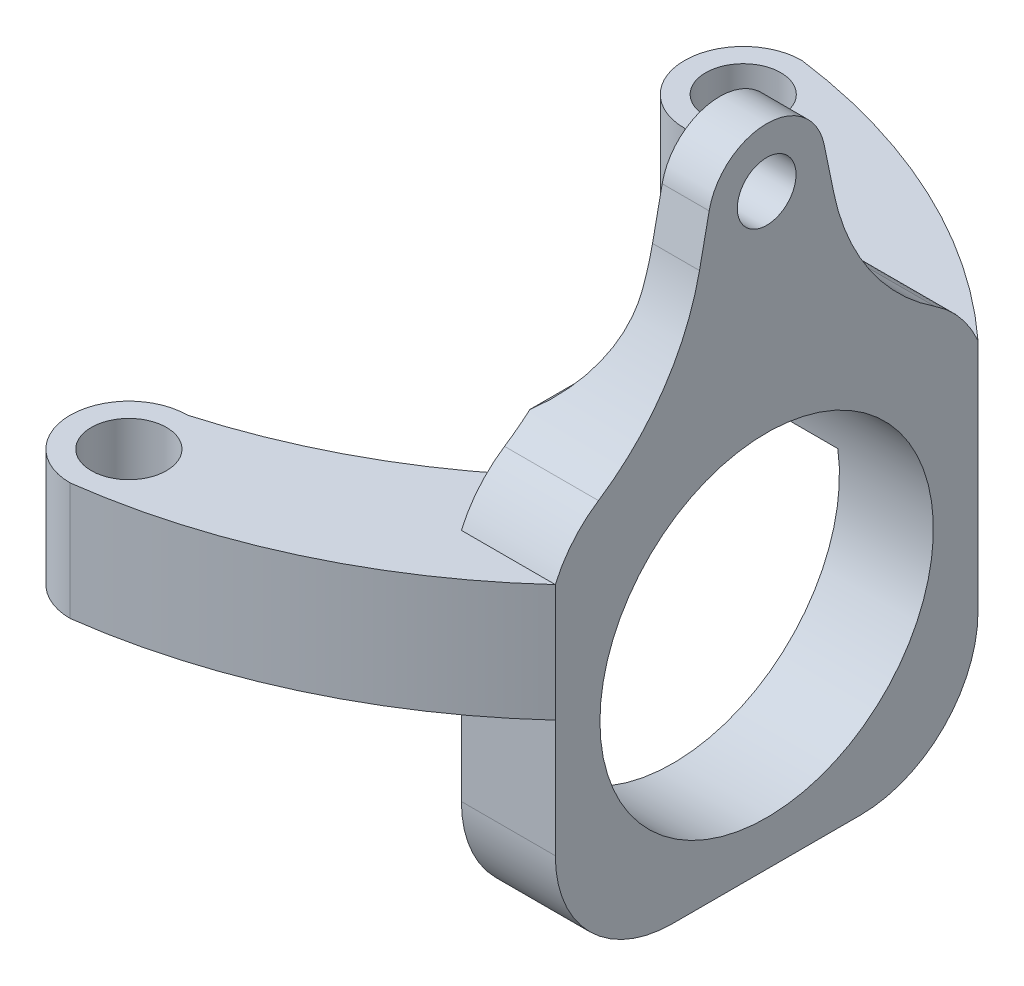
ISO-10303-21;
HEADER;
FILE_DESCRIPTION(('STEP AP214'),'2;1');
FILE_NAME('part.step','',(''),(''),'','','');
FILE_SCHEMA(('AUTOMOTIVE_DESIGN { 1 0 10303 214 1 1 1 1 }'));
ENDSEC;
DATA;
#1=APPLICATION_CONTEXT('core data for automotive mechanical design processes');
#2=APPLICATION_PROTOCOL_DEFINITION('international standard','automotive_design',2000,#1);
#3=PRODUCT_CONTEXT('',#1,'mechanical');
#4=PRODUCT('Part','Part','',(#3));
#5=PRODUCT_RELATED_PRODUCT_CATEGORY('part','',(#4));
#6=PRODUCT_DEFINITION_FORMATION('','',#4);
#7=PRODUCT_DEFINITION_CONTEXT('part definition',#1,'design');
#8=PRODUCT_DEFINITION('design','',#6,#7);
#9=PRODUCT_DEFINITION_SHAPE('','',#8);
#10=(LENGTH_UNIT() NAMED_UNIT(*) SI_UNIT(.MILLI.,.METRE.));
#11=(NAMED_UNIT(*) PLANE_ANGLE_UNIT() SI_UNIT($,.RADIAN.));
#12=(NAMED_UNIT(*) SI_UNIT($,.STERADIAN.) SOLID_ANGLE_UNIT());
#13=UNCERTAINTY_MEASURE_WITH_UNIT(LENGTH_MEASURE(1.E-05),#10,'distance_accuracy_value','');
#14=(GEOMETRIC_REPRESENTATION_CONTEXT(3) GLOBAL_UNCERTAINTY_ASSIGNED_CONTEXT((#13)) GLOBAL_UNIT_ASSIGNED_CONTEXT((#10,
#11,#12)) REPRESENTATION_CONTEXT('',''));
#15=CARTESIAN_POINT('',(0.,0.,0.));
#16=DIRECTION('',(0.,0.,1.));
#17=DIRECTION('',(1.,0.,0.));
#18=AXIS2_PLACEMENT_3D('',#15,#16,#17);
#19=CARTESIAN_POINT('',(0.,0.,0.));
#20=DIRECTION('',(0.,1.,0.));
#21=DIRECTION('',(0.,0.,1.));
#22=AXIS2_PLACEMENT_3D('',#19,#20,#21);
#23=PLANE('',#22);
#24=CARTESIAN_POINT('',(13.0814754519511,0.,13.0814754519511));
#25=DIRECTION('',(0.,1.,0.));
#26=DIRECTION('',(0.,0.,1.));
#27=AXIS2_PLACEMENT_3D('',#24,#25,#26);
#28=CIRCLE('',#27,1.6);
#29=CARTESIAN_POINT('',(13.0814754519511,0.,14.6814754519511));
#30=VERTEX_POINT('',#29);
#31=EDGE_CURVE('E392',#30,#30,#28,.T.);
#32=ORIENTED_EDGE('',*,*,#31,.T.);
#33=EDGE_LOOP('',(#32));
#34=FACE_BOUND('',#33,.T.);
#35=DIRECTION('',(-1.,0.,0.));
#36=VECTOR('',#35,1.);
#37=CARTESIAN_POINT('',(27.160012,0.,7.02922470831599));
#38=LINE('',#37,#36);
#39=CARTESIAN_POINT('',(23.16,0.,7.02922470831599));
#40=VERTEX_POINT('',#39);
#41=CARTESIAN_POINT('',(20.5928172828734,0.,7.02922470831598));
#42=VERTEX_POINT('',#41);
#43=EDGE_CURVE('E272',#40,#42,#38,.T.);
#44=ORIENTED_EDGE('',*,*,#43,.F.);
#45=DIRECTION('',(0.,0.,1.));
#46=VECTOR('',#45,1.);
#47=CARTESIAN_POINT('',(23.16,0.,0.));
#48=LINE('',#47,#46);
#49=CARTESIAN_POINT('',(23.16,0.,9.00000000000001));
#50=VERTEX_POINT('',#49);
#51=EDGE_CURVE('E431',#40,#50,#48,.T.);
#52=ORIENTED_EDGE('',*,*,#51,.T.);
#53=DIRECTION('',(1.,0.,0.));
#54=VECTOR('',#53,1.);
#55=CARTESIAN_POINT('',(0.,0.,9.00000000000001));
#56=LINE('',#55,#54);
#57=CARTESIAN_POINT('',(27.16,0.,9.00000000000001));
#58=VERTEX_POINT('',#57);
#59=EDGE_CURVE('E366',#50,#58,#56,.T.);
#60=ORIENTED_EDGE('',*,*,#59,.T.);
#61=CARTESIAN_POINT('',(9.70020057178157,0.,-10.));
#62=DIRECTION('',(0.,1.,0.));
#63=DIRECTION('',(0.,0.,1.));
#64=AXIS2_PLACEMENT_3D('',#61,#62,#63);
#65=CIRCLE('',#64,25.8039647355521);
#66=CARTESIAN_POINT('',(13.0814754519511,0.,15.5814693920883));
#67=VERTEX_POINT('',#66);
#68=EDGE_CURVE('E388',#67,#58,#65,.T.);
#69=ORIENTED_EDGE('',*,*,#68,.F.);
#70=CARTESIAN_POINT('',(13.0814754519511,0.,13.0814754519511));
#71=DIRECTION('',(0.,1.,0.));
#72=DIRECTION('',(0.,0.,1.));
#73=AXIS2_PLACEMENT_3D('',#70,#71,#72);
#74=CIRCLE('',#73,2.49999394013718);
#75=CARTESIAN_POINT('',(13.0814754519511,0.,10.5814815118139));
#76=VERTEX_POINT('',#75);
#77=EDGE_CURVE('E380',#76,#67,#74,.T.);
#78=ORIENTED_EDGE('',*,*,#77,.F.);
#79=CARTESIAN_POINT('',(6.04634623357923,0.,-14.0120818103403));
#80=DIRECTION('',(0.,1.,0.));
#81=DIRECTION('',(0.,0.,1.));
#82=AXIS2_PLACEMENT_3D('',#79,#80,#81);
#83=CIRCLE('',#82,25.58);
#84=EDGE_CURVE('E374',#76,#42,#83,.T.);
#85=ORIENTED_EDGE('',*,*,#84,.T.);
#86=EDGE_LOOP('',(#44,#52,#60,#69,#78,#85));
#87=FACE_BOUND('',#86,.T.);
#88=ADVANCED_FACE('F47',(#34,#87),#23,.F.);
#89=CARTESIAN_POINT('',(6.04634623357923,5.,14.0120818103403));
#90=DIRECTION('',(0.,-1.,0.));
#91=DIRECTION('',(0.,0.,-1.));
#92=AXIS2_PLACEMENT_3D('',#89,#90,#91);
#93=CYLINDRICAL_SURFACE('',#92,25.58);
#94=CARTESIAN_POINT('',(23.16,4.04083326445143,-5.));
#95=CARTESIAN_POINT('',(23.0852943202328,3.97412735172246,-5.06724700390507));
#96=CARTESIAN_POINT('',(23.0109565428041,3.90588068818783,-5.13336354920835));
#97=CARTESIAN_POINT('',(22.863200328918,3.76623627002666,-5.2632779060603));
#98=CARTESIAN_POINT('',(22.7897819922412,3.69483817713681,-5.32707546735068));
#99=CARTESIAN_POINT('',(22.570841527965,3.47546964969385,-5.51519434159949));
#100=CARTESIAN_POINT('',(22.4270091501767,3.32265760815931,-5.63590515854725));
#101=CARTESIAN_POINT('',(22.1427514474512,2.99996249508106,-5.8694855010599));
#102=CARTESIAN_POINT('',(22.0024771011734,2.82977114061024,-5.98211546763139));
#103=CARTESIAN_POINT('',(21.7319251102006,2.47477232280944,-6.19506174037352));
#104=CARTESIAN_POINT('',(21.6016359235024,2.28998225213862,-6.2953923465647));
#105=CARTESIAN_POINT('',(21.322546358829,1.85450736729992,-6.50649415832463));
#106=CARTESIAN_POINT('',(21.177709605604,1.59916275058544,-6.61322386028865));
#107=CARTESIAN_POINT('',(20.9853938491709,1.19854894091981,-6.75249268057375));
#108=CARTESIAN_POINT('',(20.9256329567606,1.06264991574295,-6.79531584655178));
#109=CARTESIAN_POINT('',(20.815724353177,0.784974750039779,-6.87347285181422));
#110=CARTESIAN_POINT('',(20.7655690389633,0.64320336664378,-6.90881261674726));
#111=CARTESIAN_POINT('',(20.6959264969238,0.417353286927893,-6.95759021633829));
#112=CARTESIAN_POINT('',(20.672598335456,0.335050697740693,-6.97386205457585));
#113=CARTESIAN_POINT('',(20.6297505464991,0.168723740126676,-7.00365967338303));
#114=CARTESIAN_POINT('',(20.6102415790482,0.0846952559486462,-7.01717777192724));
#115=CARTESIAN_POINT('',(20.5928172828734,0.,-7.02922470831599));
#116=B_SPLINE_CURVE_WITH_KNOTS('',3,(#94,#95,#96,#97,#98,#99,#100,#101,#102,#103,#104,#105,#106,
#107,#108,#109,#110,#111,#112,#113,#114,#115),.UNSPECIFIED.,.F.,.F.,(4,2,2,2,2,2,2,2,2,2,4),(0.,
0.36187449644276,0.723787930124017,1.44942294603131,2.19149503318238,2.9326959881572,
3.86614154665823,4.32921569978565,4.79192179012689,5.05302885628701,5.31485464009586),.UNSPECIFIED.);
#117=CARTESIAN_POINT('',(23.16,4.04083326445143,-5.));
#118=VERTEX_POINT('',#117);
#119=CARTESIAN_POINT('',(20.5928172828734,0.,-7.02922470831598));
#120=VERTEX_POINT('',#119);
#121=EDGE_CURVE('E262',#118,#120,#116,.T.);
#122=ORIENTED_EDGE('',*,*,#121,.F.);
#123=DIRECTION('',(0.,-1.,0.));
#124=VECTOR('',#123,1.);
#125=CARTESIAN_POINT('',(23.16,5.,-5.));
#126=LINE('',#125,#124);
#127=CARTESIAN_POINT('',(23.16,5.,-5.));
#128=VERTEX_POINT('',#127);
#129=EDGE_CURVE('E414',#128,#118,#126,.T.);
#130=ORIENTED_EDGE('',*,*,#129,.F.);
#131=CARTESIAN_POINT('',(6.04634623357923,5.,14.0120818103403));
#132=DIRECTION('',(0.,1.,0.));
#133=DIRECTION('',(0.,0.,1.));
#134=AXIS2_PLACEMENT_3D('',#131,#132,#133);
#135=CIRCLE('',#134,25.58);
#136=CARTESIAN_POINT('',(13.0814754519511,5.,-10.5814815118139));
#137=VERTEX_POINT('',#136);
#138=EDGE_CURVE('E542',#137,#128,#135,.F.);
#139=ORIENTED_EDGE('',*,*,#138,.F.);
#140=DIRECTION('',(0.,-1.,0.));
#141=VECTOR('',#140,1.);
#142=CARTESIAN_POINT('',(13.0814754519511,5.,-10.5814815118139));
#143=LINE('',#142,#141);
#144=CARTESIAN_POINT('',(13.0814754519511,0.,-10.5814815118139));
#145=VERTEX_POINT('',#144);
#146=EDGE_CURVE('E372',#137,#145,#143,.T.);
#147=ORIENTED_EDGE('',*,*,#146,.T.);
#148=CARTESIAN_POINT('',(6.04634623357923,0.,14.0120818103403));
#149=DIRECTION('',(0.,1.,0.));
#150=DIRECTION('',(0.,0.,1.));
#151=AXIS2_PLACEMENT_3D('',#148,#149,#150);
#152=CIRCLE('',#151,25.58);
#153=EDGE_CURVE('E359',#145,#120,#152,.F.);
#154=ORIENTED_EDGE('',*,*,#153,.T.);
#155=EDGE_LOOP('',(#122,#130,#139,#147,#154));
#156=FACE_BOUND('',#155,.T.);
#157=ADVANCED_FACE('F274',(#156),#93,.F.);
#158=CARTESIAN_POINT('',(23.16,5.,0.));
#159=DIRECTION('',(-1.,0.,0.));
#160=DIRECTION('',(0.,0.,1.));
#161=AXIS2_PLACEMENT_3D('',#158,#159,#160);
#162=PLANE('',#161);
#163=DIRECTION('',(0.,0.,1.));
#164=VECTOR('',#163,1.);
#165=CARTESIAN_POINT('',(23.16,8.,-8.99999999999999));
#166=LINE('',#165,#164);
#167=CARTESIAN_POINT('',(23.16,8.,-6.08085473935847));
#168=VERTEX_POINT('',#167);
#169=CARTESIAN_POINT('',(23.16,8.,6.08085473935848));
#170=VERTEX_POINT('',#169);
#171=EDGE_CURVE('E64',#168,#170,#166,.T.);
#172=ORIENTED_EDGE('',*,*,#171,.F.);
#173=CARTESIAN_POINT('',(23.16,15.5367170879168,-12.6533653355236));
#174=DIRECTION('',(-1.,0.,0.));
#175=DIRECTION('',(0.,0.,1.));
#176=AXIS2_PLACEMENT_3D('',#173,#174,#175);
#177=CIRCLE('',#176,10.);
#178=CARTESIAN_POINT('',(23.16,7.17890569597227,-7.16273798187063));
#179=VERTEX_POINT('',#178);
#180=EDGE_CURVE('E503',#168,#179,#177,.F.);
#181=ORIENTED_EDGE('',*,*,#180,.T.);
#182=CARTESIAN_POINT('',(23.16,3.,-4.41742430504415));
#183=DIRECTION('',(-1.,0.,0.));
#184=DIRECTION('',(0.,0.,1.));
#185=AXIS2_PLACEMENT_3D('',#182,#183,#184);
#186=CIRCLE('',#185,5.);
#187=CARTESIAN_POINT('',(23.16,5.,-8.99999999999999));
#188=VERTEX_POINT('',#187);
#189=EDGE_CURVE('E471',#179,#188,#186,.T.);
#190=ORIENTED_EDGE('',*,*,#189,.T.);
#191=DIRECTION('',(0.,0.,1.));
#192=VECTOR('',#191,1.);
#193=CARTESIAN_POINT('',(23.16,5.,0.));
#194=LINE('',#193,#192);
#195=EDGE_CURVE('E537',#188,#128,#194,.T.);
#196=ORIENTED_EDGE('',*,*,#195,.T.);
#197=ORIENTED_EDGE('',*,*,#129,.T.);
#198=CARTESIAN_POINT('',(23.16,-1.,0.));
#199=DIRECTION('',(-1.,0.,0.));
#200=DIRECTION('',(0.,0.,1.));
#201=AXIS2_PLACEMENT_3D('',#198,#199,#200);
#202=CIRCLE('',#201,7.1);
#203=CARTESIAN_POINT('',(23.16,4.04083326445141,5.00000000000001));
#204=VERTEX_POINT('',#203);
#205=EDGE_CURVE('E263',#118,#204,#202,.F.);
#206=ORIENTED_EDGE('',*,*,#205,.T.);
#207=DIRECTION('',(0.,-1.,0.));
#208=VECTOR('',#207,1.);
#209=CARTESIAN_POINT('',(23.16,5.,5.00000000000001));
#210=LINE('',#209,#208);
#211=CARTESIAN_POINT('',(23.16,5.,5.00000000000001));
#212=VERTEX_POINT('',#211);
#213=EDGE_CURVE('E410',#212,#204,#210,.T.);
#214=ORIENTED_EDGE('',*,*,#213,.F.);
#215=CARTESIAN_POINT('',(23.16,5.,9.00000000000001));
#216=VERTEX_POINT('',#215);
#217=EDGE_CURVE('E545',#212,#216,#194,.T.);
#218=ORIENTED_EDGE('',*,*,#217,.T.);
#219=CARTESIAN_POINT('',(23.16,3.,4.41742430504417));
#220=DIRECTION('',(-1.,0.,0.));
#221=DIRECTION('',(0.,0.,1.));
#222=AXIS2_PLACEMENT_3D('',#219,#220,#221);
#223=CIRCLE('',#222,5.);
#224=CARTESIAN_POINT('',(23.16,7.17890569597227,7.16273798187064));
#225=VERTEX_POINT('',#224);
#226=EDGE_CURVE('E467',#216,#225,#223,.T.);
#227=ORIENTED_EDGE('',*,*,#226,.T.);
#228=CARTESIAN_POINT('',(23.16,15.5367170879168,12.6533653355236));
#229=DIRECTION('',(-1.,0.,0.));
#230=DIRECTION('',(0.,0.,1.));
#231=AXIS2_PLACEMENT_3D('',#228,#229,#230);
#232=CIRCLE('',#231,10.);
#233=EDGE_CURVE('E645',#225,#170,#232,.F.);
#234=ORIENTED_EDGE('',*,*,#233,.T.);
#235=EDGE_LOOP('',(#172,#181,#190,#196,#197,#206,#214,#218,#227,#234));
#236=FACE_BOUND('',#235,.T.);
#237=ADVANCED_FACE('F307',(#236),#162,.T.);
#238=CARTESIAN_POINT('',(6.04634623357923,5.,-14.0120818103403));
#239=DIRECTION('',(0.,-1.,0.));
#240=DIRECTION('',(0.,0.,-1.));
#241=AXIS2_PLACEMENT_3D('',#238,#239,#240);
#242=CYLINDRICAL_SURFACE('',#241,25.58);
#243=ORIENTED_EDGE('',*,*,#213,.T.);
#244=CARTESIAN_POINT('',(23.16,4.04083326445141,5.00000000000001));
#245=CARTESIAN_POINT('',(23.0852943202328,3.97412735172244,5.06724700390508));
#246=CARTESIAN_POINT('',(23.0109565428041,3.90588068818782,5.13336354920836));
#247=CARTESIAN_POINT('',(22.863200328918,3.76623627002664,5.26327790606031));
#248=CARTESIAN_POINT('',(22.7897819922412,3.6948381771368,5.32707546735069));
#249=CARTESIAN_POINT('',(22.570841527965,3.47546964969384,5.5151943415995));
#250=CARTESIAN_POINT('',(22.4270091501767,3.3226576081593,5.63590515854726));
#251=CARTESIAN_POINT('',(22.1427514474512,2.99996249508104,5.86948550105991));
#252=CARTESIAN_POINT('',(22.0024771011734,2.82977114061023,5.98211546763139));
#253=CARTESIAN_POINT('',(21.7319251102006,2.47477232280943,6.19506174037353));
#254=CARTESIAN_POINT('',(21.6016359235024,2.28998225213862,6.2953923465647));
#255=CARTESIAN_POINT('',(21.322546358829,1.85450736729991,6.50649415832464));
#256=CARTESIAN_POINT('',(21.177709605604,1.59916275058543,6.61322386028865));
#257=CARTESIAN_POINT('',(20.9853938491709,1.19854894091981,6.75249268057375));
#258=CARTESIAN_POINT('',(20.9256329567606,1.06264991574294,6.79531584655179));
#259=CARTESIAN_POINT('',(20.8157243531771,0.784974750039771,6.87347285181422));
#260=CARTESIAN_POINT('',(20.7655690389633,0.643203366643772,6.90881261674726));
#261=CARTESIAN_POINT('',(20.6959264969238,0.417353286927885,6.95759021633829));
#262=CARTESIAN_POINT('',(20.672598335456,0.335050697740686,6.97386205457585));
#263=CARTESIAN_POINT('',(20.6297505464991,0.16872374012667,7.00365967338304));
#264=CARTESIAN_POINT('',(20.6102415790482,0.0846952559486421,7.01717777192724));
#265=CARTESIAN_POINT('',(20.5928172828734,0.,7.02922470831599));
#266=B_SPLINE_CURVE_WITH_KNOTS('',3,(#244,#245,#246,#247,#248,#249,#250,#251,#252,#253,#254,
#255,#256,#257,#258,#259,#260,#261,#262,#263,#264,#265),.UNSPECIFIED.,.F.,.F.,(4,2,2,2,2,2,2,2,
2,2,4),(0.,0.361874496442758,0.723787930124015,1.44942294603131,2.19149503318237,
2.93269598815719,3.86614154665822,4.32921569978564,4.79192179012688,5.05302885628699,
5.31485464009584),.UNSPECIFIED.);
#267=EDGE_CURVE('E291',#204,#42,#266,.T.);
#268=ORIENTED_EDGE('',*,*,#267,.T.);
#269=ORIENTED_EDGE('',*,*,#84,.F.);
#270=DIRECTION('',(0.,-1.,0.));
#271=VECTOR('',#270,1.);
#272=CARTESIAN_POINT('',(13.0814754519511,5.,10.5814815118139));
#273=LINE('',#272,#271);
#274=CARTESIAN_POINT('',(13.0814754519511,5.,10.5814815118139));
#275=VERTEX_POINT('',#274);
#276=EDGE_CURVE('E407',#275,#76,#273,.T.);
#277=ORIENTED_EDGE('',*,*,#276,.F.);
#278=CARTESIAN_POINT('',(6.04634623357923,5.,-14.0120818103403));
#279=DIRECTION('',(0.,1.,0.));
#280=DIRECTION('',(0.,0.,1.));
#281=AXIS2_PLACEMENT_3D('',#278,#279,#280);
#282=CIRCLE('',#281,25.58);
#283=EDGE_CURVE('E564',#275,#212,#282,.T.);
#284=ORIENTED_EDGE('',*,*,#283,.T.);
#285=EDGE_LOOP('',(#243,#268,#269,#277,#284));
#286=FACE_BOUND('',#285,.T.);
#287=ADVANCED_FACE('F302',(#286),#242,.F.);
#288=CARTESIAN_POINT('',(13.0814754519511,0.,-13.0814754519511));
#289=DIRECTION('',(0.,1.,0.));
#290=DIRECTION('',(0.,0.,1.));
#291=AXIS2_PLACEMENT_3D('',#288,#289,#290);
#292=CIRCLE('',#291,1.6);
#293=CARTESIAN_POINT('',(13.0814754519511,0.,-11.4814754519511));
#294=VERTEX_POINT('',#293);
#295=EDGE_CURVE('E352',#294,#294,#292,.T.);
#296=ORIENTED_EDGE('',*,*,#295,.T.);
#297=EDGE_LOOP('',(#296));
#298=FACE_BOUND('',#297,.T.);
#299=DIRECTION('',(-1.,0.,0.));
#300=VECTOR('',#299,1.);
#301=CARTESIAN_POINT('',(27.160012,0.,-7.02922470831599));
#302=LINE('',#301,#300);
#303=CARTESIAN_POINT('',(23.16,0.,-7.02922470831599));
#304=VERTEX_POINT('',#303);
#305=EDGE_CURVE('E356',#120,#304,#302,.F.);
#306=ORIENTED_EDGE('',*,*,#305,.F.);
#307=ORIENTED_EDGE('',*,*,#153,.F.);
#308=CARTESIAN_POINT('',(13.0814754519511,0.,-13.0814754519511));
#309=DIRECTION('',(0.,1.,0.));
#310=DIRECTION('',(0.,0.,1.));
#311=AXIS2_PLACEMENT_3D('',#308,#309,#310);
#312=CIRCLE('',#311,2.49999394013718);
#313=CARTESIAN_POINT('',(13.0814754519511,0.,-15.5814693920883));
#314=VERTEX_POINT('',#313);
#315=EDGE_CURVE('E375',#145,#314,#312,.F.);
#316=ORIENTED_EDGE('',*,*,#315,.T.);
#317=CARTESIAN_POINT('',(9.70020057178158,0.,10.));
#318=DIRECTION('',(0.,1.,0.));
#319=DIRECTION('',(0.,0.,1.));
#320=AXIS2_PLACEMENT_3D('',#317,#318,#319);
#321=CIRCLE('',#320,25.8039647355521);
#322=CARTESIAN_POINT('',(27.16,0.,-8.99999999999999));
#323=VERTEX_POINT('',#322);
#324=EDGE_CURVE('E382',#314,#323,#321,.F.);
#325=ORIENTED_EDGE('',*,*,#324,.T.);
#326=DIRECTION('',(-1.,0.,0.));
#327=VECTOR('',#326,1.);
#328=CARTESIAN_POINT('',(0.,0.,-8.99999999999998));
#329=LINE('',#328,#327);
#330=CARTESIAN_POINT('',(23.16,0.,-8.99999999999999));
#331=VERTEX_POINT('',#330);
#332=EDGE_CURVE('E426',#323,#331,#329,.T.);
#333=ORIENTED_EDGE('',*,*,#332,.T.);
#334=EDGE_CURVE('E363',#331,#304,#48,.T.);
#335=ORIENTED_EDGE('',*,*,#334,.T.);
#336=EDGE_LOOP('',(#306,#307,#316,#325,#333,#335));
#337=FACE_BOUND('',#336,.T.);
#338=ADVANCED_FACE('F306',(#298,#337),#23,.F.);
#339=CARTESIAN_POINT('',(0.,5.,0.));
#340=DIRECTION('',(0.,1.,0.));
#341=DIRECTION('',(0.,0.,1.));
#342=AXIS2_PLACEMENT_3D('',#339,#340,#341);
#343=PLANE('',#342);
#344=DIRECTION('',(1.,0.,0.));
#345=VECTOR('',#344,1.);
#346=CARTESIAN_POINT('',(0.,5.,9.00000000000001));
#347=LINE('',#346,#345);
#348=CARTESIAN_POINT('',(27.16,5.,9.00000000000001));
#349=VERTEX_POINT('',#348);
#350=EDGE_CURVE('E544',#216,#349,#347,.T.);
#351=ORIENTED_EDGE('',*,*,#350,.F.);
#352=ORIENTED_EDGE('',*,*,#217,.F.);
#353=ORIENTED_EDGE('',*,*,#283,.F.);
#354=CARTESIAN_POINT('',(13.0814754519511,5.,13.0814754519511));
#355=DIRECTION('',(0.,1.,0.));
#356=DIRECTION('',(0.,0.,1.));
#357=AXIS2_PLACEMENT_3D('',#354,#355,#356);
#358=CIRCLE('',#357,2.49999394013718);
#359=CARTESIAN_POINT('',(13.0814754519511,5.,15.5814693920883));
#360=VERTEX_POINT('',#359);
#361=EDGE_CURVE('E568',#275,#360,#358,.T.);
#362=ORIENTED_EDGE('',*,*,#361,.T.);
#363=CARTESIAN_POINT('',(9.70020057178157,5.,-10.));
#364=DIRECTION('',(0.,1.,0.));
#365=DIRECTION('',(0.,0.,1.));
#366=AXIS2_PLACEMENT_3D('',#363,#364,#365);
#367=CIRCLE('',#366,25.8039647355521);
#368=EDGE_CURVE('E571',#360,#349,#367,.T.);
#369=ORIENTED_EDGE('',*,*,#368,.T.);
#370=EDGE_LOOP('',(#351,#352,#353,#362,#369));
#371=FACE_BOUND('',#370,.T.);
#372=CARTESIAN_POINT('',(13.0814754519511,5.,13.0814754519511));
#373=DIRECTION('',(0.,1.,0.));
#374=DIRECTION('',(0.,0.,1.));
#375=AXIS2_PLACEMENT_3D('',#372,#373,#374);
#376=CIRCLE('',#375,1.6);
#377=CARTESIAN_POINT('',(13.0814754519511,5.,14.6814754519511));
#378=VERTEX_POINT('',#377);
#379=EDGE_CURVE('E575',#378,#378,#376,.T.);
#380=ORIENTED_EDGE('',*,*,#379,.F.);
#381=EDGE_LOOP('',(#380));
#382=FACE_BOUND('',#381,.T.);
#383=ADVANCED_FACE('F341',(#371,#382),#343,.T.);
#384=CARTESIAN_POINT('',(27.16,5.,0.));
#385=DIRECTION('',(-1.,0.,0.));
#386=DIRECTION('',(0.,0.,1.));
#387=AXIS2_PLACEMENT_3D('',#384,#385,#386);
#388=PLANE('',#387);
#389=CARTESIAN_POINT('',(27.16,-1.,0.));
#390=DIRECTION('',(-1.,0.,0.));
#391=DIRECTION('',(0.,0.,1.));
#392=AXIS2_PLACEMENT_3D('',#389,#390,#391);
#393=CIRCLE('',#392,7.1);
#394=CARTESIAN_POINT('',(27.16,-1.,7.1));
#395=VERTEX_POINT('',#394);
#396=EDGE_CURVE('E300',#395,#395,#393,.F.);
#397=ORIENTED_EDGE('',*,*,#396,.F.);
#398=EDGE_LOOP('',(#397));
#399=FACE_BOUND('',#398,.T.);
#400=DIRECTION('',(0.,0.,-1.));
#401=VECTOR('',#400,1.);
#402=CARTESIAN_POINT('',(27.16,-10.,-8.99999999999999));
#403=LINE('',#402,#401);
#404=CARTESIAN_POINT('',(27.16,-10.,4.00000000000001));
#405=VERTEX_POINT('',#404);
#406=CARTESIAN_POINT('',(27.16,-10.,-3.99999999999999));
#407=VERTEX_POINT('',#406);
#408=EDGE_CURVE('E612',#405,#407,#403,.T.);
#409=ORIENTED_EDGE('',*,*,#408,.T.);
#410=CARTESIAN_POINT('',(27.16,-5.,-3.99999999999999));
#411=DIRECTION('',(-1.,0.,0.));
#412=DIRECTION('',(0.,0.,1.));
#413=AXIS2_PLACEMENT_3D('',#410,#411,#412);
#414=CIRCLE('',#413,5.);
#415=CARTESIAN_POINT('',(27.16,-5.,-8.99999999999999));
#416=VERTEX_POINT('',#415);
#417=EDGE_CURVE('E460',#407,#416,#414,.F.);
#418=ORIENTED_EDGE('',*,*,#417,.T.);
#419=DIRECTION('',(0.,1.,0.));
#420=VECTOR('',#419,1.);
#421=CARTESIAN_POINT('',(27.16,-10.,-8.99999999999999));
#422=LINE('',#421,#420);
#423=EDGE_CURVE('E587',#416,#323,#422,.T.);
#424=ORIENTED_EDGE('',*,*,#423,.T.);
#425=DIRECTION('',(0.,-1.,0.));
#426=VECTOR('',#425,1.);
#427=CARTESIAN_POINT('',(27.16,5.,-9.));
#428=LINE('',#427,#426);
#429=CARTESIAN_POINT('',(27.16,5.,-9.));
#430=VERTEX_POINT('',#429);
#431=EDGE_CURVE('E422',#430,#323,#428,.T.);
#432=ORIENTED_EDGE('',*,*,#431,.F.);
#433=CARTESIAN_POINT('',(27.16,3.,-4.41742430504415));
#434=DIRECTION('',(-1.,0.,0.));
#435=DIRECTION('',(0.,0.,1.));
#436=AXIS2_PLACEMENT_3D('',#433,#434,#435);
#437=CIRCLE('',#436,5.);
#438=CARTESIAN_POINT('',(27.16,7.17890569597227,-7.16273798187063));
#439=VERTEX_POINT('',#438);
#440=EDGE_CURVE('E453',#430,#439,#437,.F.);
#441=ORIENTED_EDGE('',*,*,#440,.T.);
#442=CARTESIAN_POINT('',(27.16,15.5367170879168,-12.6533653355236));
#443=DIRECTION('',(-1.,0.,0.));
#444=DIRECTION('',(0.,0.,1.));
#445=AXIS2_PLACEMENT_3D('',#442,#443,#444);
#446=CIRCLE('',#445,10.);
#447=CARTESIAN_POINT('',(27.16,13.5121910212227,-2.86044471880889));
#448=VERTEX_POINT('',#447);
#449=EDGE_CURVE('E489',#439,#448,#446,.T.);
#450=ORIENTED_EDGE('',*,*,#449,.T.);
#451=DIRECTION('',(0.,-0.979292061671471,-0.202452606669413));
#452=VECTOR('',#451,1.);
#453=CARTESIAN_POINT('',(27.16,1.12093738588213,-5.42213361281946));
#454=LINE('',#453,#452);
#455=CARTESIAN_POINT('',(27.16,15.5061315166735,-2.44823015417868));
#456=VERTEX_POINT('',#455);
#457=EDGE_CURVE('E239',#456,#448,#454,.T.);
#458=ORIENTED_EDGE('',*,*,#457,.F.);
#459=CARTESIAN_POINT('',(27.16,15.,0.));
#460=DIRECTION('',(1.,0.,0.));
#461=DIRECTION('',(0.,0.,-1.));
#462=AXIS2_PLACEMENT_3D('',#459,#460,#461);
#463=CIRCLE('',#462,2.5);
#464=CARTESIAN_POINT('',(27.16,15.5061315166735,2.44823015417868));
#465=VERTEX_POINT('',#464);
#466=EDGE_CURVE('E248',#456,#465,#463,.T.);
#467=ORIENTED_EDGE('',*,*,#466,.T.);
#468=DIRECTION('',(0.,0.979292061671471,-0.202452606669411));
#469=VECTOR('',#468,1.);
#470=CARTESIAN_POINT('',(27.16,1.12093738588212,5.42213361281945));
#471=LINE('',#470,#469);
#472=CARTESIAN_POINT('',(27.16,13.5121910212227,2.86044471880888));
#473=VERTEX_POINT('',#472);
#474=EDGE_CURVE('E225',#473,#465,#471,.T.);
#475=ORIENTED_EDGE('',*,*,#474,.F.);
#476=CARTESIAN_POINT('',(27.16,15.5367170879168,12.6533653355236));
#477=DIRECTION('',(-1.,0.,0.));
#478=DIRECTION('',(0.,0.,1.));
#479=AXIS2_PLACEMENT_3D('',#476,#477,#478);
#480=CIRCLE('',#479,10.);
#481=CARTESIAN_POINT('',(27.16,7.17890569597227,7.16273798187064));
#482=VERTEX_POINT('',#481);
#483=EDGE_CURVE('E634',#473,#482,#480,.T.);
#484=ORIENTED_EDGE('',*,*,#483,.T.);
#485=CARTESIAN_POINT('',(27.16,3.,4.41742430504417));
#486=DIRECTION('',(-1.,0.,0.));
#487=DIRECTION('',(0.,0.,1.));
#488=AXIS2_PLACEMENT_3D('',#485,#486,#487);
#489=CIRCLE('',#488,5.);
#490=EDGE_CURVE('E450',#482,#349,#489,.F.);
#491=ORIENTED_EDGE('',*,*,#490,.T.);
#492=DIRECTION('',(0.,-1.,0.));
#493=VECTOR('',#492,1.);
#494=CARTESIAN_POINT('',(27.16,5.,9.00000000000001));
#495=LINE('',#494,#493);
#496=EDGE_CURVE('E398',#349,#58,#495,.T.);
#497=ORIENTED_EDGE('',*,*,#496,.T.);
#498=DIRECTION('',(0.,1.,0.));
#499=VECTOR('',#498,1.);
#500=CARTESIAN_POINT('',(27.16,-10.,9.00000000000001));
#501=LINE('',#500,#499);
#502=CARTESIAN_POINT('',(27.16,-5.,9.00000000000001));
#503=VERTEX_POINT('',#502);
#504=EDGE_CURVE('E619',#503,#58,#501,.T.);
#505=ORIENTED_EDGE('',*,*,#504,.F.);
#506=CARTESIAN_POINT('',(27.16,-5.,4.00000000000001));
#507=DIRECTION('',(-1.,0.,0.));
#508=DIRECTION('',(0.,0.,1.));
#509=AXIS2_PLACEMENT_3D('',#506,#507,#508);
#510=CIRCLE('',#509,5.);
#511=EDGE_CURVE('E457',#503,#405,#510,.F.);
#512=ORIENTED_EDGE('',*,*,#511,.T.);
#513=EDGE_LOOP('',(#409,#418,#424,#432,#441,#450,#458,#467,#475,#484,#491,#497,#505,#512));
#514=FACE_BOUND('',#513,.T.);
#515=CARTESIAN_POINT('',(27.16,15.,0.));
#516=DIRECTION('',(1.,0.,0.));
#517=DIRECTION('',(0.,0.,-1.));
#518=AXIS2_PLACEMENT_3D('',#515,#516,#517);
#519=CIRCLE('',#518,1.25);
#520=CARTESIAN_POINT('',(27.16,15.,-1.25));
#521=VERTEX_POINT('',#520);
#522=EDGE_CURVE('E244',#521,#521,#519,.T.);
#523=ORIENTED_EDGE('',*,*,#522,.F.);
#524=EDGE_LOOP('',(#523));
#525=FACE_BOUND('',#524,.T.);
#526=ADVANCED_FACE('F346',(#399,#514,#525),#388,.F.);
#527=CARTESIAN_POINT('',(9.70020057178158,5.,10.));
#528=DIRECTION('',(0.,-1.,0.));
#529=DIRECTION('',(0.,0.,-1.));
#530=AXIS2_PLACEMENT_3D('',#527,#528,#529);
#531=CYLINDRICAL_SURFACE('',#530,25.8039647355521);
#532=ORIENTED_EDGE('',*,*,#324,.F.);
#533=DIRECTION('',(0.,-1.,0.));
#534=VECTOR('',#533,1.);
#535=CARTESIAN_POINT('',(13.0814754519511,5.,-15.5814693920883));
#536=LINE('',#535,#534);
#537=CARTESIAN_POINT('',(13.0814754519511,5.,-15.5814693920883));
#538=VERTEX_POINT('',#537);
#539=EDGE_CURVE('E419',#538,#314,#536,.T.);
#540=ORIENTED_EDGE('',*,*,#539,.F.);
#541=CARTESIAN_POINT('',(9.70020057178158,5.,10.));
#542=DIRECTION('',(0.,1.,0.));
#543=DIRECTION('',(0.,0.,1.));
#544=AXIS2_PLACEMENT_3D('',#541,#542,#543);
#545=CIRCLE('',#544,25.8039647355521);
#546=EDGE_CURVE('E397',#538,#430,#545,.F.);
#547=ORIENTED_EDGE('',*,*,#546,.T.);
#548=ORIENTED_EDGE('',*,*,#431,.T.);
#549=EDGE_LOOP('',(#532,#540,#547,#548));
#550=FACE_BOUND('',#549,.T.);
#551=ADVANCED_FACE('F323',(#550),#531,.T.);
#552=CARTESIAN_POINT('',(13.0814754519511,5.,-13.0814754519511));
#553=DIRECTION('',(0.,-1.,0.));
#554=DIRECTION('',(0.,0.,-1.));
#555=AXIS2_PLACEMENT_3D('',#552,#553,#554);
#556=CYLINDRICAL_SURFACE('',#555,2.49999394013718);
#557=ORIENTED_EDGE('',*,*,#315,.F.);
#558=ORIENTED_EDGE('',*,*,#146,.F.);
#559=CARTESIAN_POINT('',(13.0814754519511,5.,-13.0814754519511));
#560=DIRECTION('',(0.,1.,0.));
#561=DIRECTION('',(0.,0.,1.));
#562=AXIS2_PLACEMENT_3D('',#559,#560,#561);
#563=CIRCLE('',#562,2.49999394013718);
#564=EDGE_CURVE('E558',#137,#538,#563,.F.);
#565=ORIENTED_EDGE('',*,*,#564,.T.);
#566=ORIENTED_EDGE('',*,*,#539,.T.);
#567=EDGE_LOOP('',(#557,#558,#565,#566));
#568=FACE_BOUND('',#567,.T.);
#569=ADVANCED_FACE('F313',(#568),#556,.T.);
#570=DIRECTION('',(0.,1.,0.));
#571=VECTOR('',#570,1.);
#572=CARTESIAN_POINT('',(23.16,-10.,-8.99999999999999));
#573=LINE('',#572,#571);
#574=CARTESIAN_POINT('',(23.16,-5.,-8.99999999999999));
#575=VERTEX_POINT('',#574);
#576=EDGE_CURVE('E592',#575,#331,#573,.T.);
#577=ORIENTED_EDGE('',*,*,#576,.F.);
#578=CARTESIAN_POINT('',(23.16,-5.,-3.99999999999999));
#579=DIRECTION('',(-1.,0.,0.));
#580=DIRECTION('',(0.,0.,1.));
#581=AXIS2_PLACEMENT_3D('',#578,#579,#580);
#582=CIRCLE('',#581,5.);
#583=CARTESIAN_POINT('',(23.16,-10.,-3.99999999999999));
#584=VERTEX_POINT('',#583);
#585=EDGE_CURVE('E441',#575,#584,#582,.T.);
#586=ORIENTED_EDGE('',*,*,#585,.T.);
#587=DIRECTION('',(0.,0.,1.));
#588=VECTOR('',#587,1.);
#589=CARTESIAN_POINT('',(23.16,-10.,-8.99999999999999));
#590=LINE('',#589,#588);
#591=CARTESIAN_POINT('',(23.16,-10.,4.00000000000001));
#592=VERTEX_POINT('',#591);
#593=EDGE_CURVE('E593',#584,#592,#590,.T.);
#594=ORIENTED_EDGE('',*,*,#593,.T.);
#595=CARTESIAN_POINT('',(23.16,-5.,4.00000000000001));
#596=DIRECTION('',(-1.,0.,0.));
#597=DIRECTION('',(0.,0.,1.));
#598=AXIS2_PLACEMENT_3D('',#595,#596,#597);
#599=CIRCLE('',#598,5.);
#600=CARTESIAN_POINT('',(23.16,-5.,9.00000000000001));
#601=VERTEX_POINT('',#600);
#602=EDGE_CURVE('E438',#592,#601,#599,.T.);
#603=ORIENTED_EDGE('',*,*,#602,.T.);
#604=DIRECTION('',(0.,1.,0.));
#605=VECTOR('',#604,1.);
#606=CARTESIAN_POINT('',(23.16,-10.,9.00000000000001));
#607=LINE('',#606,#605);
#608=EDGE_CURVE('E596',#601,#50,#607,.T.);
#609=ORIENTED_EDGE('',*,*,#608,.T.);
#610=ORIENTED_EDGE('',*,*,#51,.F.);
#611=EDGE_CURVE('E257',#40,#304,#202,.F.);
#612=ORIENTED_EDGE('',*,*,#611,.T.);
#613=ORIENTED_EDGE('',*,*,#334,.F.);
#614=EDGE_LOOP('',(#577,#586,#594,#603,#609,#610,#612,#613));
#615=FACE_BOUND('',#614,.T.);
#616=ADVANCED_FACE('F311',(#615),#162,.T.);
#617=CARTESIAN_POINT('',(13.0814754519511,5.,13.0814754519511));
#618=DIRECTION('',(0.,-1.,0.));
#619=DIRECTION('',(0.,0.,-1.));
#620=AXIS2_PLACEMENT_3D('',#617,#618,#619);
#621=CYLINDRICAL_SURFACE('',#620,2.49999394013718);
#622=ORIENTED_EDGE('',*,*,#77,.T.);
#623=DIRECTION('',(0.,-1.,0.));
#624=VECTOR('',#623,1.);
#625=CARTESIAN_POINT('',(13.0814754519511,5.,15.5814693920883));
#626=LINE('',#625,#624);
#627=EDGE_CURVE('E402',#360,#67,#626,.T.);
#628=ORIENTED_EDGE('',*,*,#627,.F.);
#629=ORIENTED_EDGE('',*,*,#361,.F.);
#630=ORIENTED_EDGE('',*,*,#276,.T.);
#631=EDGE_LOOP('',(#622,#628,#629,#630));
#632=FACE_BOUND('',#631,.T.);
#633=ADVANCED_FACE('F309',(#632),#621,.T.);
#634=CARTESIAN_POINT('',(13.0814754519511,5.,13.0814754519511));
#635=DIRECTION('',(0.,-1.,0.));
#636=DIRECTION('',(0.,0.,-1.));
#637=AXIS2_PLACEMENT_3D('',#634,#635,#636);
#638=CYLINDRICAL_SURFACE('',#637,1.6);
#639=ORIENTED_EDGE('',*,*,#379,.T.);
#640=EDGE_LOOP('',(#639));
#641=FACE_BOUND('',#640,.T.);
#642=ORIENTED_EDGE('',*,*,#31,.F.);
#643=EDGE_LOOP('',(#642));
#644=FACE_BOUND('',#643,.T.);
#645=ADVANCED_FACE('F320',(#641,#644),#638,.F.);
#646=CARTESIAN_POINT('',(9.70020057178157,5.,-10.));
#647=DIRECTION('',(0.,-1.,0.));
#648=DIRECTION('',(0.,0.,-1.));
#649=AXIS2_PLACEMENT_3D('',#646,#647,#648);
#650=CYLINDRICAL_SURFACE('',#649,25.8039647355521);
#651=ORIENTED_EDGE('',*,*,#68,.T.);
#652=ORIENTED_EDGE('',*,*,#496,.F.);
#653=ORIENTED_EDGE('',*,*,#368,.F.);
#654=ORIENTED_EDGE('',*,*,#627,.T.);
#655=EDGE_LOOP('',(#651,#652,#653,#654));
#656=FACE_BOUND('',#655,.T.);
#657=ADVANCED_FACE('F630',(#656),#650,.T.);
#658=CARTESIAN_POINT('',(13.0814754519511,5.,-13.0814754519511));
#659=DIRECTION('',(0.,-1.,0.));
#660=DIRECTION('',(0.,0.,-1.));
#661=AXIS2_PLACEMENT_3D('',#658,#659,#660);
#662=CYLINDRICAL_SURFACE('',#661,1.6);
#663=CARTESIAN_POINT('',(13.0814754519511,5.,-13.0814754519511));
#664=DIRECTION('',(0.,1.,0.));
#665=DIRECTION('',(0.,0.,1.));
#666=AXIS2_PLACEMENT_3D('',#663,#664,#665);
#667=CIRCLE('',#666,1.6);
#668=CARTESIAN_POINT('',(13.0814754519511,5.,-11.4814754519511));
#669=VERTEX_POINT('',#668);
#670=EDGE_CURVE('E403',#669,#669,#667,.T.);
#671=ORIENTED_EDGE('',*,*,#670,.T.);
#672=EDGE_LOOP('',(#671));
#673=FACE_BOUND('',#672,.T.);
#674=ORIENTED_EDGE('',*,*,#295,.F.);
#675=EDGE_LOOP('',(#674));
#676=FACE_BOUND('',#675,.T.);
#677=ADVANCED_FACE('F877',(#673,#676),#662,.F.);
#678=ORIENTED_EDGE('',*,*,#195,.F.);
#679=DIRECTION('',(-1.,0.,0.));
#680=VECTOR('',#679,1.);
#681=CARTESIAN_POINT('',(0.,5.,-8.99999999999998));
#682=LINE('',#681,#680);
#683=EDGE_CURVE('E534',#430,#188,#682,.T.);
#684=ORIENTED_EDGE('',*,*,#683,.F.);
#685=ORIENTED_EDGE('',*,*,#546,.F.);
#686=ORIENTED_EDGE('',*,*,#564,.F.);
#687=ORIENTED_EDGE('',*,*,#138,.T.);
#688=EDGE_LOOP('',(#678,#684,#685,#686,#687));
#689=FACE_BOUND('',#688,.T.);
#690=ORIENTED_EDGE('',*,*,#670,.F.);
#691=EDGE_LOOP('',(#690));
#692=FACE_BOUND('',#691,.T.);
#693=ADVANCED_FACE('F348',(#689,#692),#343,.T.);
#694=CARTESIAN_POINT('',(0.,-10.,0.));
#695=DIRECTION('',(0.,-1.,0.));
#696=DIRECTION('',(0.,0.,-1.));
#697=AXIS2_PLACEMENT_3D('',#694,#695,#696);
#698=PLANE('',#697);
#699=ORIENTED_EDGE('',*,*,#593,.F.);
#700=DIRECTION('',(-1.,0.,0.));
#701=VECTOR('',#700,1.);
#702=CARTESIAN_POINT('',(0.,-10.,-3.99999999999998));
#703=LINE('',#702,#701);
#704=EDGE_CURVE('E447',#584,#407,#703,.F.);
#705=ORIENTED_EDGE('',*,*,#704,.T.);
#706=ORIENTED_EDGE('',*,*,#408,.F.);
#707=DIRECTION('',(1.,0.,0.));
#708=VECTOR('',#707,1.);
#709=CARTESIAN_POINT('',(0.,-10.,4.00000000000001));
#710=LINE('',#709,#708);
#711=EDGE_CURVE('E444',#405,#592,#710,.F.);
#712=ORIENTED_EDGE('',*,*,#711,.T.);
#713=EDGE_LOOP('',(#699,#705,#706,#712));
#714=FACE_BOUND('',#713,.T.);
#715=ADVANCED_FACE('F288',(#714),#698,.T.);
#716=CARTESIAN_POINT('',(27.16,-10.,-8.99999999999999));
#717=DIRECTION('',(0.,0.,-1.));
#718=DIRECTION('',(-1.,0.,0.));
#719=AXIS2_PLACEMENT_3D('',#716,#717,#718);
#720=PLANE('',#719);
#721=ORIENTED_EDGE('',*,*,#423,.F.);
#722=DIRECTION('',(-1.,0.,0.));
#723=VECTOR('',#722,1.);
#724=CARTESIAN_POINT('',(27.16,-5.,-8.99999999999999));
#725=LINE('',#724,#723);
#726=EDGE_CURVE('E365',#416,#575,#725,.T.);
#727=ORIENTED_EDGE('',*,*,#726,.T.);
#728=ORIENTED_EDGE('',*,*,#576,.T.);
#729=ORIENTED_EDGE('',*,*,#332,.F.);
#730=EDGE_LOOP('',(#721,#727,#728,#729));
#731=FACE_BOUND('',#730,.T.);
#732=ADVANCED_FACE('F594',(#731),#720,.T.);
#733=CARTESIAN_POINT('',(27.16,-10.,9.00000000000001));
#734=DIRECTION('',(0.,0.,1.));
#735=DIRECTION('',(1.,0.,0.));
#736=AXIS2_PLACEMENT_3D('',#733,#734,#735);
#737=PLANE('',#736);
#738=ORIENTED_EDGE('',*,*,#608,.F.);
#739=DIRECTION('',(1.,0.,0.));
#740=VECTOR('',#739,1.);
#741=CARTESIAN_POINT('',(27.16,-5.,9.00000000000001));
#742=LINE('',#741,#740);
#743=EDGE_CURVE('E463',#601,#503,#742,.T.);
#744=ORIENTED_EDGE('',*,*,#743,.T.);
#745=ORIENTED_EDGE('',*,*,#504,.T.);
#746=ORIENTED_EDGE('',*,*,#59,.F.);
#747=EDGE_LOOP('',(#738,#744,#745,#746));
#748=FACE_BOUND('',#747,.T.);
#749=ADVANCED_FACE('F284',(#748),#737,.T.);
#750=CARTESIAN_POINT('',(27.160012,-1.,0.));
#751=DIRECTION('',(-1.,0.,0.));
#752=DIRECTION('',(0.,0.,1.));
#753=AXIS2_PLACEMENT_3D('',#750,#751,#752);
#754=CYLINDRICAL_SURFACE('',#753,7.1);
#755=ORIENTED_EDGE('',*,*,#121,.T.);
#756=ORIENTED_EDGE('',*,*,#305,.T.);
#757=ORIENTED_EDGE('',*,*,#611,.F.);
#758=ORIENTED_EDGE('',*,*,#43,.T.);
#759=ORIENTED_EDGE('',*,*,#267,.F.);
#760=ORIENTED_EDGE('',*,*,#205,.F.);
#761=EDGE_LOOP('',(#755,#756,#757,#758,#759,#760));
#762=FACE_BOUND('',#761,.T.);
#763=ORIENTED_EDGE('',*,*,#396,.T.);
#764=EDGE_LOOP('',(#763));
#765=FACE_BOUND('',#764,.T.);
#766=ADVANCED_FACE('F278',(#762,#765),#754,.F.);
#767=CARTESIAN_POINT('',(27.16,-5.,-3.99999999999999));
#768=DIRECTION('',(-1.,0.,0.));
#769=DIRECTION('',(0.,0.,1.));
#770=AXIS2_PLACEMENT_3D('',#767,#768,#769);
#771=CYLINDRICAL_SURFACE('',#770,5.);
#772=ORIENTED_EDGE('',*,*,#417,.F.);
#773=ORIENTED_EDGE('',*,*,#704,.F.);
#774=ORIENTED_EDGE('',*,*,#585,.F.);
#775=ORIENTED_EDGE('',*,*,#726,.F.);
#776=EDGE_LOOP('',(#772,#773,#774,#775));
#777=FACE_BOUND('',#776,.T.);
#778=ADVANCED_FACE('F283',(#777),#771,.T.);
#779=CARTESIAN_POINT('',(27.16,-5.,4.00000000000001));
#780=DIRECTION('',(1.,0.,0.));
#781=DIRECTION('',(0.,0.,-1.));
#782=AXIS2_PLACEMENT_3D('',#779,#780,#781);
#783=CYLINDRICAL_SURFACE('',#782,5.);
#784=ORIENTED_EDGE('',*,*,#602,.F.);
#785=ORIENTED_EDGE('',*,*,#711,.F.);
#786=ORIENTED_EDGE('',*,*,#511,.F.);
#787=ORIENTED_EDGE('',*,*,#743,.F.);
#788=EDGE_LOOP('',(#784,#785,#786,#787));
#789=FACE_BOUND('',#788,.T.);
#790=ADVANCED_FACE('F662',(#789),#783,.T.);
#791=CARTESIAN_POINT('',(27.16,3.,-4.41742430504415));
#792=DIRECTION('',(1.,0.,0.));
#793=DIRECTION('',(0.,0.,-1.));
#794=AXIS2_PLACEMENT_3D('',#791,#792,#793);
#795=CYLINDRICAL_SURFACE('',#794,5.);
#796=ORIENTED_EDGE('',*,*,#189,.F.);
#797=DIRECTION('',(1.,0.,0.));
#798=VECTOR('',#797,1.);
#799=CARTESIAN_POINT('',(27.16,7.17890569597227,-7.16273798187063));
#800=LINE('',#799,#798);
#801=EDGE_CURVE('E476',#179,#439,#800,.T.);
#802=ORIENTED_EDGE('',*,*,#801,.T.);
#803=ORIENTED_EDGE('',*,*,#440,.F.);
#804=ORIENTED_EDGE('',*,*,#683,.T.);
#805=EDGE_LOOP('',(#796,#802,#803,#804));
#806=FACE_BOUND('',#805,.T.);
#807=ADVANCED_FACE('F532',(#806),#795,.T.);
#808=CARTESIAN_POINT('',(27.16,3.,4.41742430504417));
#809=DIRECTION('',(-1.,0.,0.));
#810=DIRECTION('',(0.,0.,1.));
#811=AXIS2_PLACEMENT_3D('',#808,#809,#810);
#812=CYLINDRICAL_SURFACE('',#811,5.);
#813=ORIENTED_EDGE('',*,*,#490,.F.);
#814=DIRECTION('',(-1.,0.,0.));
#815=VECTOR('',#814,1.);
#816=CARTESIAN_POINT('',(27.16,7.17890569597227,7.16273798187064));
#817=LINE('',#816,#815);
#818=EDGE_CURVE('E486',#482,#225,#817,.T.);
#819=ORIENTED_EDGE('',*,*,#818,.T.);
#820=ORIENTED_EDGE('',*,*,#226,.F.);
#821=ORIENTED_EDGE('',*,*,#350,.T.);
#822=EDGE_LOOP('',(#813,#819,#820,#821));
#823=FACE_BOUND('',#822,.T.);
#824=ADVANCED_FACE('F643',(#823),#812,.T.);
#825=CARTESIAN_POINT('',(25.16,15.,0.));
#826=DIRECTION('',(1.,0.,0.));
#827=DIRECTION('',(0.,0.,-1.));
#828=AXIS2_PLACEMENT_3D('',#825,#826,#827);
#829=CYLINDRICAL_SURFACE('',#828,2.5);
#830=ORIENTED_EDGE('',*,*,#466,.F.);
#831=DIRECTION('',(1.,0.,0.));
#832=VECTOR('',#831,1.);
#833=CARTESIAN_POINT('',(25.16,15.5061315166735,-2.44823015417868));
#834=LINE('',#833,#832);
#835=CARTESIAN_POINT('',(25.16,15.5061315166735,-2.44823015417868));
#836=VERTEX_POINT('',#835);
#837=EDGE_CURVE('E230',#836,#456,#834,.T.);
#838=ORIENTED_EDGE('',*,*,#837,.F.);
#839=CARTESIAN_POINT('',(25.16,15.,0.));
#840=DIRECTION('',(1.,0.,0.));
#841=DIRECTION('',(0.,0.,-1.));
#842=AXIS2_PLACEMENT_3D('',#839,#840,#841);
#843=CIRCLE('',#842,2.5);
#844=CARTESIAN_POINT('',(25.16,15.5061315166735,2.44823015417868));
#845=VERTEX_POINT('',#844);
#846=EDGE_CURVE('E213',#836,#845,#843,.T.);
#847=ORIENTED_EDGE('',*,*,#846,.T.);
#848=DIRECTION('',(1.,0.,0.));
#849=VECTOR('',#848,1.);
#850=CARTESIAN_POINT('',(25.16,15.5061315166735,2.44823015417868));
#851=LINE('',#850,#849);
#852=EDGE_CURVE('E222',#845,#465,#851,.T.);
#853=ORIENTED_EDGE('',*,*,#852,.T.);
#854=EDGE_LOOP('',(#830,#838,#847,#853));
#855=FACE_BOUND('',#854,.T.);
#856=ADVANCED_FACE('F232',(#855),#829,.T.);
#857=CARTESIAN_POINT('',(25.16,1.12093738588213,-5.42213361281946));
#858=DIRECTION('',(0.,-0.202452606669413,0.979292061671471));
#859=DIRECTION('',(0.,-0.979292061671471,-0.202452606669413));
#860=AXIS2_PLACEMENT_3D('',#857,#858,#859);
#861=PLANE('',#860);
#862=ORIENTED_EDGE('',*,*,#457,.T.);
#863=DIRECTION('',(1.,0.,0.));
#864=VECTOR('',#863,1.);
#865=CARTESIAN_POINT('',(25.16,13.5121910212227,-2.86044471880889));
#866=LINE('',#865,#864);
#867=CARTESIAN_POINT('',(25.16,13.5121910212227,-2.86044471880889));
#868=VERTEX_POINT('',#867);
#869=EDGE_CURVE('E480',#448,#868,#866,.F.);
#870=ORIENTED_EDGE('',*,*,#869,.T.);
#871=DIRECTION('',(0.,-0.979292061671471,-0.202452606669413));
#872=VECTOR('',#871,1.);
#873=CARTESIAN_POINT('',(25.16,1.12093738588213,-5.42213361281946));
#874=LINE('',#873,#872);
#875=EDGE_CURVE('E219',#836,#868,#874,.T.);
#876=ORIENTED_EDGE('',*,*,#875,.F.);
#877=ORIENTED_EDGE('',*,*,#837,.T.);
#878=EDGE_LOOP('',(#862,#870,#876,#877));
#879=FACE_BOUND('',#878,.T.);
#880=ADVANCED_FACE('F522',(#879),#861,.F.);
#881=CARTESIAN_POINT('',(25.16,15.,0.));
#882=DIRECTION('',(1.,0.,0.));
#883=DIRECTION('',(0.,0.,-1.));
#884=AXIS2_PLACEMENT_3D('',#881,#882,#883);
#885=CYLINDRICAL_SURFACE('',#884,1.25);
#886=CARTESIAN_POINT('',(25.16,15.,0.));
#887=DIRECTION('',(1.,0.,0.));
#888=DIRECTION('',(0.,0.,-1.));
#889=AXIS2_PLACEMENT_3D('',#886,#887,#888);
#890=CIRCLE('',#889,1.25);
#891=CARTESIAN_POINT('',(25.16,15.,-1.25));
#892=VERTEX_POINT('',#891);
#893=EDGE_CURVE('E235',#892,#892,#890,.T.);
#894=ORIENTED_EDGE('',*,*,#893,.F.);
#895=EDGE_LOOP('',(#894));
#896=FACE_BOUND('',#895,.T.);
#897=ORIENTED_EDGE('',*,*,#522,.T.);
#898=EDGE_LOOP('',(#897));
#899=FACE_BOUND('',#898,.T.);
#900=ADVANCED_FACE('F286',(#896,#899),#885,.F.);
#901=CARTESIAN_POINT('',(25.16,1.12093738588212,5.42213361281945));
#902=DIRECTION('',(0.,-0.202452606669411,-0.979292061671471));
#903=DIRECTION('',(0.,0.979292061671471,-0.202452606669411));
#904=AXIS2_PLACEMENT_3D('',#901,#902,#903);
#905=PLANE('',#904);
#906=DIRECTION('',(0.,0.979292061671471,-0.202452606669411));
#907=VECTOR('',#906,1.);
#908=CARTESIAN_POINT('',(25.16,1.12093738588212,5.42213361281945));
#909=LINE('',#908,#907);
#910=CARTESIAN_POINT('',(25.16,13.5121910212227,2.86044471880888));
#911=VERTEX_POINT('',#910);
#912=EDGE_CURVE('E208',#911,#845,#909,.T.);
#913=ORIENTED_EDGE('',*,*,#912,.F.);
#914=DIRECTION('',(-1.,0.,0.));
#915=VECTOR('',#914,1.);
#916=CARTESIAN_POINT('',(25.16,13.5121910212227,2.86044471880888));
#917=LINE('',#916,#915);
#918=EDGE_CURVE('E483',#911,#473,#917,.F.);
#919=ORIENTED_EDGE('',*,*,#918,.T.);
#920=ORIENTED_EDGE('',*,*,#474,.T.);
#921=ORIENTED_EDGE('',*,*,#852,.F.);
#922=EDGE_LOOP('',(#913,#919,#920,#921));
#923=FACE_BOUND('',#922,.T.);
#924=ADVANCED_FACE('F223',(#923),#905,.F.);
#925=CARTESIAN_POINT('',(25.16,0.,0.));
#926=DIRECTION('',(1.,0.,0.));
#927=DIRECTION('',(0.,0.,-1.));
#928=AXIS2_PLACEMENT_3D('',#925,#926,#927);
#929=PLANE('',#928);
#930=ORIENTED_EDGE('',*,*,#893,.T.);
#931=EDGE_LOOP('',(#930));
#932=FACE_BOUND('',#931,.T.);
#933=ORIENTED_EDGE('',*,*,#875,.T.);
#934=CARTESIAN_POINT('',(25.16,15.5367170879168,-12.6533653355236));
#935=DIRECTION('',(1.,0.,0.));
#936=DIRECTION('',(0.,0.,-1.));
#937=AXIS2_PLACEMENT_3D('',#934,#935,#936);
#938=CIRCLE('',#937,10.);
#939=CARTESIAN_POINT('',(25.16,12.,-3.2996691548666));
#940=VERTEX_POINT('',#939);
#941=EDGE_CURVE('E492',#868,#940,#938,.T.);
#942=ORIENTED_EDGE('',*,*,#941,.T.);
#943=DIRECTION('',(0.,0.,-1.));
#944=VECTOR('',#943,1.);
#945=CARTESIAN_POINT('',(25.16,12.,0.));
#946=LINE('',#945,#944);
#947=CARTESIAN_POINT('',(25.16,12.,3.2996691548666));
#948=VERTEX_POINT('',#947);
#949=EDGE_CURVE('E71',#940,#948,#946,.F.);
#950=ORIENTED_EDGE('',*,*,#949,.T.);
#951=CARTESIAN_POINT('',(25.16,15.5367170879168,12.6533653355236));
#952=DIRECTION('',(1.,0.,0.));
#953=DIRECTION('',(0.,0.,-1.));
#954=AXIS2_PLACEMENT_3D('',#951,#952,#953);
#955=CIRCLE('',#954,10.);
#956=EDGE_CURVE('E11',#948,#911,#955,.T.);
#957=ORIENTED_EDGE('',*,*,#956,.T.);
#958=ORIENTED_EDGE('',*,*,#912,.T.);
#959=ORIENTED_EDGE('',*,*,#846,.F.);
#960=EDGE_LOOP('',(#933,#942,#950,#957,#958,#959));
#961=FACE_BOUND('',#960,.T.);
#962=ADVANCED_FACE('F211',(#932,#961),#929,.F.);
#963=CARTESIAN_POINT('',(20.16,12.,0.));
#964=DIRECTION('',(0.,0.,-1.));
#965=DIRECTION('',(-1.,0.,0.));
#966=AXIS2_PLACEMENT_3D('',#963,#964,#965);
#967=CYLINDRICAL_SURFACE('',#966,5.);
#968=ORIENTED_EDGE('',*,*,#949,.F.);
#969=CARTESIAN_POINT('',(25.16,12.,-3.2996691548666));
#970=CARTESIAN_POINT('',(25.1600159467745,11.8501197188802,-3.35630420536605));
#971=CARTESIAN_POINT('',(25.1532632339849,11.7016974632922,-3.41657527042285));
#972=CARTESIAN_POINT('',(25.1271157296793,11.4090044634487,-3.54363268931656));
#973=CARTESIAN_POINT('',(25.1077358634766,11.2647290275961,-3.6104112721076));
#974=CARTESIAN_POINT('',(25.0574210361098,10.9823058981893,-3.74932307969924));
#975=CARTESIAN_POINT('',(25.0265768580262,10.8441193581581,-3.82141075897384));
#976=CARTESIAN_POINT('',(24.9542035379631,10.5733775642854,-3.97067244897148));
#977=CARTESIAN_POINT('',(24.9126713768952,10.4408239139415,-4.04784789227154));
#978=CARTESIAN_POINT('',(24.8200059762034,10.1825645425811,-4.20612508117452));
#979=CARTESIAN_POINT('',(24.768922351978,10.0568275810661,-4.28720499754299));
#980=CARTESIAN_POINT('',(24.657796592281,9.81186874214831,-4.45287695837437));
#981=CARTESIAN_POINT('',(24.5977549264006,9.69264652368228,-4.53746881856935));
#982=CARTESIAN_POINT('',(24.404776093459,9.34434951556268,-4.79600297405971));
#983=CARTESIAN_POINT('',(24.2592136813206,9.12526627667316,-4.9743175047063));
#984=CARTESIAN_POINT('',(24.0309125099439,8.83325676529827,-5.23196409903091));
#985=CARTESIAN_POINT('',(23.9601592971042,8.74870700671709,-5.30927351534132));
#986=CARTESIAN_POINT('',(23.8134441981688,8.58467503973738,-5.46435812315038));
#987=CARTESIAN_POINT('',(23.7374828356232,8.5051923235193,-5.5421332671164));
#988=CARTESIAN_POINT('',(23.580875860057,8.35177080560383,-5.69718998992318));
#989=CARTESIAN_POINT('',(23.5002571969588,8.2778048627019,-5.77447200057942));
#990=CARTESIAN_POINT('',(23.3339421170569,8.13502126920435,-5.92834115324928));
#991=CARTESIAN_POINT('',(23.2482453033933,8.06620402193515,-6.00492824041353));
#992=CARTESIAN_POINT('',(23.16,8.,-6.08085473935847));
#993=B_SPLINE_CURVE_WITH_KNOTS('',3,(#969,#970,#971,#972,#973,#974,#975,#976,#977,#978,#979,
#980,#981,#982,#983,#984,#985,#986,#987,#988,#989,#990,#991,#992),.UNSPECIFIED.,.F.,.F.,(4,2,2,
2,2,2,2,2,2,2,2,4),(0.,0.480367169957231,0.960167572769539,1.43624680724781,1.91246067011726,
2.38626628944541,2.86004708004112,3.80988980464221,4.21373127777973,4.61753221404483,
5.01919376741342,5.42088675232745),.UNSPECIFIED.);
#994=EDGE_CURVE('E495',#940,#168,#993,.T.);
#995=ORIENTED_EDGE('',*,*,#994,.T.);
#996=ORIENTED_EDGE('',*,*,#171,.T.);
#997=CARTESIAN_POINT('',(23.16,8.,6.08085473935848));
#998=CARTESIAN_POINT('',(23.2296413557327,8.05223878450495,6.02094946340745));
#999=CARTESIAN_POINT('',(23.2976806266796,8.10610224583749,5.96062916138557));
#1000=CARTESIAN_POINT('',(23.4305943169036,8.21704864469774,5.83946821306471));
#1001=CARTESIAN_POINT('',(23.4954688133607,8.27413150364023,5.7786275794977));
#1002=CARTESIAN_POINT('',(23.6855010261413,8.45025350958947,5.59569679713985));
#1003=CARTESIAN_POINT('',(23.8059664633134,8.57409015616256,5.47328564315713));
#1004=CARTESIAN_POINT('',(24.0351923318687,8.83560078909868,5.22857855361295));
#1005=CARTESIAN_POINT('',(24.1438211506265,8.97340278334649,5.10629647149617));
#1006=CARTESIAN_POINT('',(24.3471263987543,9.26156328743246,4.86505886064472));
#1007=CARTESIAN_POINT('',(24.4418094745991,9.4119157618899,4.7461017692813));
#1008=CARTESIAN_POINT('',(24.5965258061964,9.68989753071418,4.53932488995546));
#1009=CARTESIAN_POINT('',(24.6595743473776,9.8150989758645,4.45048612552005));
#1010=CARTESIAN_POINT('',(24.7757654986074,10.0726535251791,4.27672327771242));
#1011=CARTESIAN_POINT('',(24.8289078437705,10.2050068204572,4.19179929906479));
#1012=CARTESIAN_POINT('',(24.9241259034047,10.4756747237163,4.02719619214588));
#1013=CARTESIAN_POINT('',(24.9662622986496,10.6139515315377,3.94749020257814));
#1014=CARTESIAN_POINT('',(25.0388847048716,10.8964847458291,3.79367554162872));
#1015=CARTESIAN_POINT('',(25.0693764861197,11.0407381513216,3.71956411261321));
#1016=CARTESIAN_POINT('',(25.1152312446611,11.3192146960378,3.58506844871023));
#1017=CARTESIAN_POINT('',(25.1318337893776,11.4529298526949,3.52405741758185));
#1018=CARTESIAN_POINT('',(25.154237325249,11.7240107206969,3.40754360592805));
#1019=CARTESIAN_POINT('',(25.1600114643887,11.8613846525978,3.35205484084575));
#1020=CARTESIAN_POINT('',(25.16,12.,3.2996691548666));
#1021=B_SPLINE_CURVE_WITH_KNOTS('',3,(#997,#998,#999,#1000,#1001,#1002,#1003,#1004,#1005,#1006,
#1007,#1008,#1009,#1010,#1011,#1012,#1013,#1014,#1015,#1016,#1017,#1018,#1019,#1020),
.UNSPECIFIED.,.F.,.F.,(4,2,2,2,2,2,2,2,2,2,2,4),(0.,0.316970625390264,0.633933516900899,
1.26831953679025,1.90916233126411,2.54969870789347,3.04713230583429,3.54457920292799,
4.03922261842335,4.53362060356945,4.97682754632459,5.42113209692101),.UNSPECIFIED.);
#1022=EDGE_CURVE('E57',#170,#948,#1021,.T.);
#1023=ORIENTED_EDGE('',*,*,#1022,.T.);
#1024=EDGE_LOOP('',(#968,#995,#996,#1023));
#1025=FACE_BOUND('',#1024,.T.);
#1026=ADVANCED_FACE('F505',(#1025),#967,.F.);
#1027=CARTESIAN_POINT('',(27.16,15.5367170879168,-12.6533653355236));
#1028=DIRECTION('',(1.,0.,0.));
#1029=DIRECTION('',(0.,0.,-1.));
#1030=AXIS2_PLACEMENT_3D('',#1027,#1028,#1029);
#1031=CYLINDRICAL_SURFACE('',#1030,10.);
#1032=ORIENTED_EDGE('',*,*,#941,.F.);
#1033=ORIENTED_EDGE('',*,*,#869,.F.);
#1034=ORIENTED_EDGE('',*,*,#449,.F.);
#1035=ORIENTED_EDGE('',*,*,#801,.F.);
#1036=ORIENTED_EDGE('',*,*,#180,.F.);
#1037=ORIENTED_EDGE('',*,*,#994,.F.);
#1038=EDGE_LOOP('',(#1032,#1033,#1034,#1035,#1036,#1037));
#1039=FACE_BOUND('',#1038,.T.);
#1040=ADVANCED_FACE('F508',(#1039),#1031,.F.);
#1041=CARTESIAN_POINT('',(27.16,15.5367170879168,12.6533653355236));
#1042=DIRECTION('',(-1.,0.,0.));
#1043=DIRECTION('',(0.,0.,1.));
#1044=AXIS2_PLACEMENT_3D('',#1041,#1042,#1043);
#1045=CYLINDRICAL_SURFACE('',#1044,10.);
#1046=ORIENTED_EDGE('',*,*,#233,.F.);
#1047=ORIENTED_EDGE('',*,*,#818,.F.);
#1048=ORIENTED_EDGE('',*,*,#483,.F.);
#1049=ORIENTED_EDGE('',*,*,#918,.F.);
#1050=ORIENTED_EDGE('',*,*,#956,.F.);
#1051=ORIENTED_EDGE('',*,*,#1022,.F.);
#1052=EDGE_LOOP('',(#1046,#1047,#1048,#1049,#1050,#1051));
#1053=FACE_BOUND('',#1052,.T.);
#1054=ADVANCED_FACE('F49',(#1053),#1045,.F.);
#1055=CLOSED_SHELL('',(#88,#157,#237,#287,#338,#383,#526,#551,#569,#616,#633,#645,#657,#677,
#693,#715,#732,#749,#766,#778,#790,#807,#824,#856,#880,#900,#924,#962,#1026,#1040,#1054));
#1056=MANIFOLD_SOLID_BREP('B2',#1055);
#1057=ADVANCED_BREP_SHAPE_REPRESENTATION('',(#18,#1056),#14);
#1058=SHAPE_DEFINITION_REPRESENTATION(#9,#1057);
ENDSEC;
END-ISO-10303-21;
